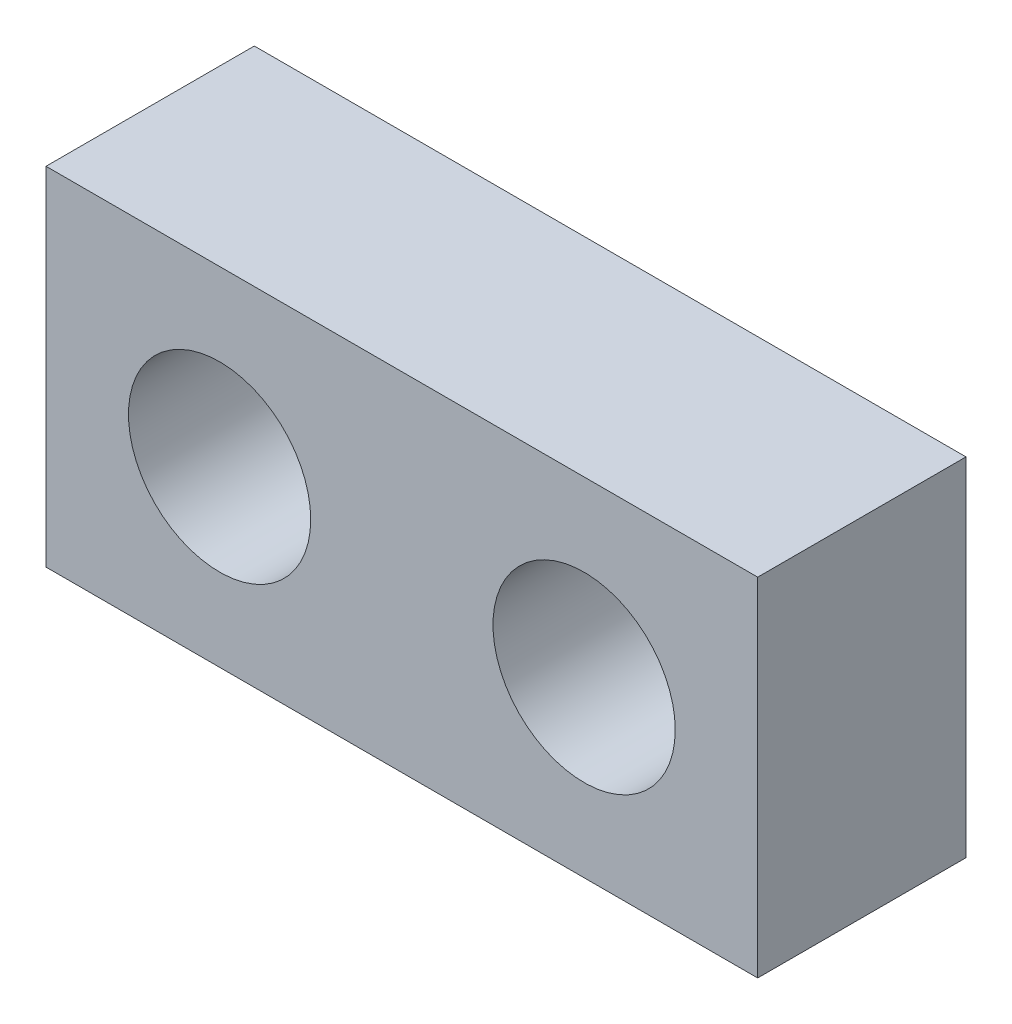
ISO-10303-21;
HEADER;
FILE_DESCRIPTION(('STEP AP214'),'2;1');
FILE_NAME('part.step','',(''),(''),'','','');
FILE_SCHEMA(('AUTOMOTIVE_DESIGN { 1 0 10303 214 1 1 1 1 }'));
ENDSEC;
DATA;
#1=APPLICATION_CONTEXT('core data for automotive mechanical design processes');
#2=APPLICATION_PROTOCOL_DEFINITION('international standard','automotive_design',2000,#1);
#3=PRODUCT_CONTEXT('',#1,'mechanical');
#4=PRODUCT('Part','Part','',(#3));
#5=PRODUCT_RELATED_PRODUCT_CATEGORY('part','',(#4));
#6=PRODUCT_DEFINITION_FORMATION('','',#4);
#7=PRODUCT_DEFINITION_CONTEXT('part definition',#1,'design');
#8=PRODUCT_DEFINITION('design','',#6,#7);
#9=PRODUCT_DEFINITION_SHAPE('','',#8);
#10=(LENGTH_UNIT() NAMED_UNIT(*) SI_UNIT(.MILLI.,.METRE.));
#11=(NAMED_UNIT(*) PLANE_ANGLE_UNIT() SI_UNIT($,.RADIAN.));
#12=(NAMED_UNIT(*) SI_UNIT($,.STERADIAN.) SOLID_ANGLE_UNIT());
#13=UNCERTAINTY_MEASURE_WITH_UNIT(LENGTH_MEASURE(1.E-05),#10,'distance_accuracy_value','');
#14=(GEOMETRIC_REPRESENTATION_CONTEXT(3) GLOBAL_UNCERTAINTY_ASSIGNED_CONTEXT((#13)) GLOBAL_UNIT_ASSIGNED_CONTEXT((#10,
#11,#12)) REPRESENTATION_CONTEXT('',''));
#15=CARTESIAN_POINT('',(0.,0.,0.));
#16=DIRECTION('',(0.,0.,1.));
#17=DIRECTION('',(1.,0.,0.));
#18=AXIS2_PLACEMENT_3D('',#15,#16,#17);
#19=CARTESIAN_POINT('',(-399998.621555494,4.99999999993861,25.8089894558988));
#20=DIRECTION('',(0.,-1.,0.));
#21=DIRECTION('',(1.,0.,0.));
#22=AXIS2_PLACEMENT_3D('',#19,#20,#21);
#23=PLANE('',#22);
#24=DIRECTION('',(-1.,0.,0.));
#25=VECTOR('',#24,1.);
#26=CARTESIAN_POINT('',(-399998.621555494,4.99999999993861,3.));
#27=LINE('',#26,#25);
#28=CARTESIAN_POINT('',(10.2499999999913,4.99999999999545,3.));
#29=VERTEX_POINT('',#28);
#30=CARTESIAN_POINT('',(-10.2499999999787,4.99999999999545,3.));
#31=VERTEX_POINT('',#30);
#32=EDGE_CURVE('E95',#29,#31,#27,.T.);
#33=ORIENTED_EDGE('',*,*,#32,.F.);
#34=DIRECTION('',(0.,0.,-1.));
#35=VECTOR('',#34,1.);
#36=CARTESIAN_POINT('',(10.2499999999913,4.99999999999545,25.8089894558988));
#37=LINE('',#36,#35);
#38=CARTESIAN_POINT('',(10.2499999999913,4.99999999999545,-3.));
#39=VERTEX_POINT('',#38);
#40=EDGE_CURVE('E49',#29,#39,#37,.T.);
#41=ORIENTED_EDGE('',*,*,#40,.T.);
#42=DIRECTION('',(-1.,0.,0.));
#43=VECTOR('',#42,1.);
#44=CARTESIAN_POINT('',(-399998.621555494,4.99999999993861,-3.));
#45=LINE('',#44,#43);
#46=CARTESIAN_POINT('',(-10.2499999999787,4.99999999999545,-3.));
#47=VERTEX_POINT('',#46);
#48=EDGE_CURVE('E93',#39,#47,#45,.T.);
#49=ORIENTED_EDGE('',*,*,#48,.T.);
#50=DIRECTION('',(0.,0.,-1.));
#51=VECTOR('',#50,1.);
#52=CARTESIAN_POINT('',(-10.2499999999787,4.99999999999545,25.8089894558988));
#53=LINE('',#52,#51);
#54=EDGE_CURVE('E84',#31,#47,#53,.T.);
#55=ORIENTED_EDGE('',*,*,#54,.F.);
#56=EDGE_LOOP('',(#33,#41,#49,#55));
#57=FACE_BOUND('',#56,.T.);
#58=ADVANCED_FACE('F45',(#57),#23,.F.);
#59=CARTESIAN_POINT('',(-10.2499999999281,-291592.009869316,25.8089894558988));
#60=DIRECTION('',(1.,0.,0.));
#61=DIRECTION('',(0.,1.,0.));
#62=AXIS2_PLACEMENT_3D('',#59,#60,#61);
#63=PLANE('',#62);
#64=DIRECTION('',(0.,-1.,0.));
#65=VECTOR('',#64,1.);
#66=CARTESIAN_POINT('',(-10.2499999999281,-291592.009869316,3.));
#67=LINE('',#66,#65);
#68=CARTESIAN_POINT('',(-10.249999999985,-5.00000000001845,3.));
#69=VERTEX_POINT('',#68);
#70=EDGE_CURVE('E54',#31,#69,#67,.T.);
#71=ORIENTED_EDGE('',*,*,#70,.F.);
#72=ORIENTED_EDGE('',*,*,#54,.T.);
#73=DIRECTION('',(0.,-1.,0.));
#74=VECTOR('',#73,1.);
#75=CARTESIAN_POINT('',(-10.2499999999281,-291592.009869316,-3.));
#76=LINE('',#75,#74);
#77=CARTESIAN_POINT('',(-10.249999999985,-5.00000000001845,-3.));
#78=VERTEX_POINT('',#77);
#79=EDGE_CURVE('E106',#47,#78,#76,.T.);
#80=ORIENTED_EDGE('',*,*,#79,.T.);
#81=DIRECTION('',(0.,0.,-1.));
#82=VECTOR('',#81,1.);
#83=CARTESIAN_POINT('',(-10.249999999985,-5.00000000001845,25.8089894558988));
#84=LINE('',#83,#82);
#85=EDGE_CURVE('E115',#69,#78,#84,.T.);
#86=ORIENTED_EDGE('',*,*,#85,.F.);
#87=EDGE_LOOP('',(#71,#72,#80,#86));
#88=FACE_BOUND('',#87,.T.);
#89=ADVANCED_FACE('F139',(#88),#63,.F.);
#90=CARTESIAN_POINT('',(-399998.621555493,-5.0000000000523,25.8089894558988));
#91=DIRECTION('',(0.,1.,0.));
#92=DIRECTION('',(-1.,0.,0.));
#93=AXIS2_PLACEMENT_3D('',#90,#91,#92);
#94=PLANE('',#93);
#95=DIRECTION('',(1.,0.,0.));
#96=VECTOR('',#95,1.);
#97=CARTESIAN_POINT('',(-399998.621555493,-5.0000000000523,3.));
#98=LINE('',#97,#96);
#99=CARTESIAN_POINT('',(10.2499999999913,-4.99999999999545,3.));
#100=VERTEX_POINT('',#99);
#101=EDGE_CURVE('E13',#69,#100,#98,.T.);
#102=ORIENTED_EDGE('',*,*,#101,.F.);
#103=ORIENTED_EDGE('',*,*,#85,.T.);
#104=DIRECTION('',(1.,0.,0.));
#105=VECTOR('',#104,1.);
#106=CARTESIAN_POINT('',(-399998.621555493,-5.0000000000523,-3.));
#107=LINE('',#106,#105);
#108=CARTESIAN_POINT('',(10.2499999999913,-4.99999999999545,-3.));
#109=VERTEX_POINT('',#108);
#110=EDGE_CURVE('E116',#78,#109,#107,.T.);
#111=ORIENTED_EDGE('',*,*,#110,.T.);
#112=DIRECTION('',(0.,0.,-1.));
#113=VECTOR('',#112,1.);
#114=CARTESIAN_POINT('',(10.2499999999913,-4.99999999999545,25.8089894558988));
#115=LINE('',#114,#113);
#116=EDGE_CURVE('E67',#100,#109,#115,.T.);
#117=ORIENTED_EDGE('',*,*,#116,.F.);
#118=EDGE_LOOP('',(#102,#103,#111,#117));
#119=FACE_BOUND('',#118,.T.);
#120=ADVANCED_FACE('F138',(#119),#94,.F.);
#121=CARTESIAN_POINT('',(10.2500000000418,-291592.009869316,25.8089894558988));
#122=DIRECTION('',(-1.,0.,0.));
#123=DIRECTION('',(0.,-1.,0.));
#124=AXIS2_PLACEMENT_3D('',#121,#122,#123);
#125=PLANE('',#124);
#126=DIRECTION('',(0.,1.,0.));
#127=VECTOR('',#126,1.);
#128=CARTESIAN_POINT('',(10.2500000000418,-291592.009869316,3.));
#129=LINE('',#128,#127);
#130=EDGE_CURVE('E103',#100,#29,#129,.T.);
#131=ORIENTED_EDGE('',*,*,#130,.F.);
#132=ORIENTED_EDGE('',*,*,#116,.T.);
#133=DIRECTION('',(0.,1.,0.));
#134=VECTOR('',#133,1.);
#135=CARTESIAN_POINT('',(10.2500000000418,-291592.009869316,-3.));
#136=LINE('',#135,#134);
#137=EDGE_CURVE('E99',#109,#39,#136,.T.);
#138=ORIENTED_EDGE('',*,*,#137,.T.);
#139=ORIENTED_EDGE('',*,*,#40,.F.);
#140=EDGE_LOOP('',(#131,#132,#138,#139));
#141=FACE_BOUND('',#140,.T.);
#142=ADVANCED_FACE('F100',(#141),#125,.F.);
#143=CARTESIAN_POINT('',(0.,0.,-3.));
#144=DIRECTION('',(0.,0.,1.));
#145=DIRECTION('',(1.,0.,0.));
#146=AXIS2_PLACEMENT_3D('',#143,#144,#145);
#147=PLANE('',#146);
#148=CARTESIAN_POINT('',(-5.25,0.,-3.));
#149=DIRECTION('',(0.,0.,1.));
#150=DIRECTION('',(1.,0.,0.));
#151=AXIS2_PLACEMENT_3D('',#148,#149,#150);
#152=CIRCLE('',#151,2.625);
#153=CARTESIAN_POINT('',(-2.625,0.,-3.));
#154=VERTEX_POINT('',#153);
#155=EDGE_CURVE('E97',#154,#154,#152,.T.);
#156=ORIENTED_EDGE('',*,*,#155,.T.);
#157=EDGE_LOOP('',(#156));
#158=FACE_BOUND('',#157,.T.);
#159=CARTESIAN_POINT('',(5.25,0.,-3.));
#160=DIRECTION('',(0.,0.,1.));
#161=DIRECTION('',(1.,0.,0.));
#162=AXIS2_PLACEMENT_3D('',#159,#160,#161);
#163=CIRCLE('',#162,2.625);
#164=CARTESIAN_POINT('',(7.875,0.,-3.));
#165=VERTEX_POINT('',#164);
#166=EDGE_CURVE('E119',#165,#165,#163,.T.);
#167=ORIENTED_EDGE('',*,*,#166,.T.);
#168=EDGE_LOOP('',(#167));
#169=FACE_BOUND('',#168,.T.);
#170=ORIENTED_EDGE('',*,*,#48,.F.);
#171=ORIENTED_EDGE('',*,*,#137,.F.);
#172=ORIENTED_EDGE('',*,*,#110,.F.);
#173=ORIENTED_EDGE('',*,*,#79,.F.);
#174=EDGE_LOOP('',(#170,#171,#172,#173));
#175=FACE_BOUND('',#174,.T.);
#176=ADVANCED_FACE('F105',(#158,#169,#175),#147,.F.);
#177=CARTESIAN_POINT('',(0.,0.,3.));
#178=DIRECTION('',(0.,0.,1.));
#179=DIRECTION('',(1.,0.,0.));
#180=AXIS2_PLACEMENT_3D('',#177,#178,#179);
#181=PLANE('',#180);
#182=CARTESIAN_POINT('',(-5.25,0.,3.));
#183=DIRECTION('',(0.,0.,1.));
#184=DIRECTION('',(1.,0.,0.));
#185=AXIS2_PLACEMENT_3D('',#182,#183,#184);
#186=CIRCLE('',#185,2.625);
#187=CARTESIAN_POINT('',(-2.625,0.,3.));
#188=VERTEX_POINT('',#187);
#189=EDGE_CURVE('E122',#188,#188,#186,.T.);
#190=ORIENTED_EDGE('',*,*,#189,.F.);
#191=EDGE_LOOP('',(#190));
#192=FACE_BOUND('',#191,.T.);
#193=CARTESIAN_POINT('',(5.25,0.,3.));
#194=DIRECTION('',(0.,0.,1.));
#195=DIRECTION('',(1.,0.,0.));
#196=AXIS2_PLACEMENT_3D('',#193,#194,#195);
#197=CIRCLE('',#196,2.625);
#198=CARTESIAN_POINT('',(7.875,0.,3.));
#199=VERTEX_POINT('',#198);
#200=EDGE_CURVE('E123',#199,#199,#197,.T.);
#201=ORIENTED_EDGE('',*,*,#200,.F.);
#202=EDGE_LOOP('',(#201));
#203=FACE_BOUND('',#202,.T.);
#204=ORIENTED_EDGE('',*,*,#130,.T.);
#205=ORIENTED_EDGE('',*,*,#32,.T.);
#206=ORIENTED_EDGE('',*,*,#70,.T.);
#207=ORIENTED_EDGE('',*,*,#101,.T.);
#208=EDGE_LOOP('',(#204,#205,#206,#207));
#209=FACE_BOUND('',#208,.T.);
#210=ADVANCED_FACE('F47',(#192,#203,#209),#181,.T.);
#211=CARTESIAN_POINT('',(5.25,0.,-3.));
#212=DIRECTION('',(0.,0.,1.));
#213=DIRECTION('',(1.,0.,0.));
#214=AXIS2_PLACEMENT_3D('',#211,#212,#213);
#215=CYLINDRICAL_SURFACE('',#214,2.625);
#216=ORIENTED_EDGE('',*,*,#166,.F.);
#217=EDGE_LOOP('',(#216));
#218=FACE_BOUND('',#217,.T.);
#219=ORIENTED_EDGE('',*,*,#200,.T.);
#220=EDGE_LOOP('',(#219));
#221=FACE_BOUND('',#220,.T.);
#222=ADVANCED_FACE('F135',(#218,#221),#215,.F.);
#223=CARTESIAN_POINT('',(-5.25,0.,-3.));
#224=DIRECTION('',(0.,0.,1.));
#225=DIRECTION('',(1.,0.,0.));
#226=AXIS2_PLACEMENT_3D('',#223,#224,#225);
#227=CYLINDRICAL_SURFACE('',#226,2.625);
#228=ORIENTED_EDGE('',*,*,#155,.F.);
#229=EDGE_LOOP('',(#228));
#230=FACE_BOUND('',#229,.T.);
#231=ORIENTED_EDGE('',*,*,#189,.T.);
#232=EDGE_LOOP('',(#231));
#233=FACE_BOUND('',#232,.T.);
#234=ADVANCED_FACE('F131',(#230,#233),#227,.F.);
#235=CLOSED_SHELL('',(#58,#89,#120,#142,#176,#210,#222,#234));
#236=MANIFOLD_SOLID_BREP('B2',#235);
#237=ADVANCED_BREP_SHAPE_REPRESENTATION('',(#18,#236),#14);
#238=SHAPE_DEFINITION_REPRESENTATION(#9,#237);
ENDSEC;
END-ISO-10303-21;
